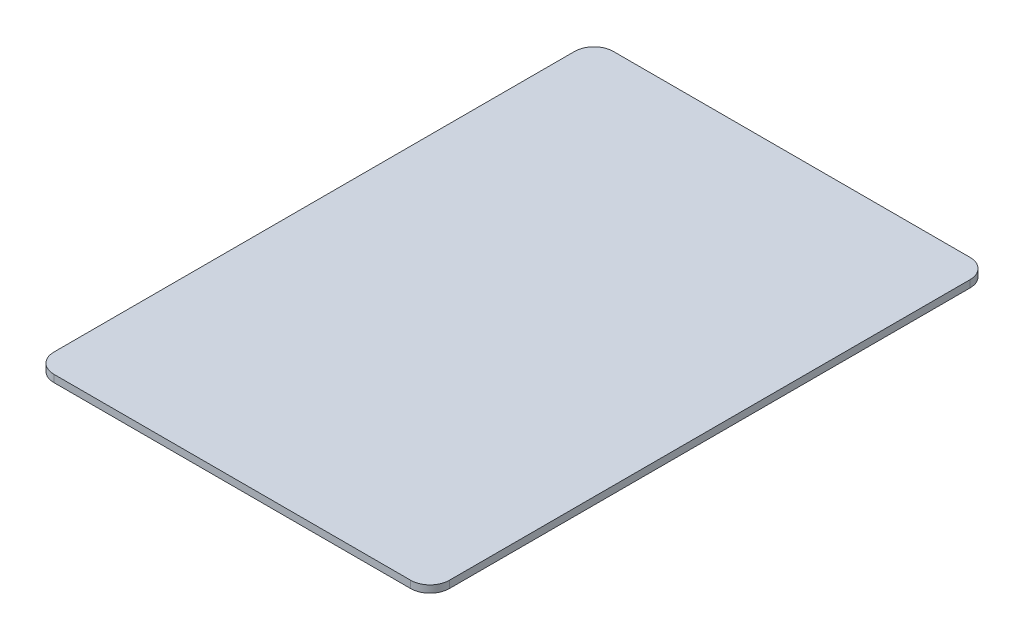
ISO-10303-21;
HEADER;
FILE_DESCRIPTION(('STEP AP214'),'2;1');
FILE_NAME('part.step','',(''),(''),'','','');
FILE_SCHEMA(('AUTOMOTIVE_DESIGN { 1 0 10303 214 1 1 1 1 }'));
ENDSEC;
DATA;
#1=APPLICATION_CONTEXT('core data for automotive mechanical design processes');
#2=APPLICATION_PROTOCOL_DEFINITION('international standard','automotive_design',2000,#1);
#3=PRODUCT_CONTEXT('',#1,'mechanical');
#4=PRODUCT('Part','Part','',(#3));
#5=PRODUCT_RELATED_PRODUCT_CATEGORY('part','',(#4));
#6=PRODUCT_DEFINITION_FORMATION('','',#4);
#7=PRODUCT_DEFINITION_CONTEXT('part definition',#1,'design');
#8=PRODUCT_DEFINITION('design','',#6,#7);
#9=PRODUCT_DEFINITION_SHAPE('','',#8);
#10=(LENGTH_UNIT() NAMED_UNIT(*) SI_UNIT(.MILLI.,.METRE.));
#11=(NAMED_UNIT(*) PLANE_ANGLE_UNIT() SI_UNIT($,.RADIAN.));
#12=(NAMED_UNIT(*) SI_UNIT($,.STERADIAN.) SOLID_ANGLE_UNIT());
#13=UNCERTAINTY_MEASURE_WITH_UNIT(LENGTH_MEASURE(1.E-05),#10,'distance_accuracy_value','');
#14=(GEOMETRIC_REPRESENTATION_CONTEXT(3) GLOBAL_UNCERTAINTY_ASSIGNED_CONTEXT((#13)) GLOBAL_UNIT_ASSIGNED_CONTEXT((#10,
#11,#12)) REPRESENTATION_CONTEXT('',''));
#15=CARTESIAN_POINT('',(0.,0.,0.));
#16=DIRECTION('',(0.,0.,1.));
#17=DIRECTION('',(1.,0.,0.));
#18=AXIS2_PLACEMENT_3D('',#15,#16,#17);
#19=CARTESIAN_POINT('',(-52.07,1.905,73.66));
#20=DIRECTION('',(-1.,0.,0.));
#21=DIRECTION('',(0.,0.,1.));
#22=AXIS2_PLACEMENT_3D('',#19,#20,#21);
#23=PLANE('',#22);
#24=DIRECTION('',(0.,0.,-1.));
#25=VECTOR('',#24,1.);
#26=CARTESIAN_POINT('',(-52.07,1.905,73.66));
#27=LINE('',#26,#25);
#28=CARTESIAN_POINT('',(-52.07,1.905,68.58));
#29=VERTEX_POINT('',#28);
#30=CARTESIAN_POINT('',(-52.07,1.905,-68.58));
#31=VERTEX_POINT('',#30);
#32=EDGE_CURVE('E162',#29,#31,#27,.T.);
#33=ORIENTED_EDGE('',*,*,#32,.T.);
#34=DIRECTION('',(0.,-1.,0.));
#35=VECTOR('',#34,1.);
#36=CARTESIAN_POINT('',(-52.07,1.905,-68.58));
#37=LINE('',#36,#35);
#38=CARTESIAN_POINT('',(-52.07,0.,-68.58));
#39=VERTEX_POINT('',#38);
#40=EDGE_CURVE('E118',#31,#39,#37,.T.);
#41=ORIENTED_EDGE('',*,*,#40,.T.);
#42=DIRECTION('',(0.,0.,-1.));
#43=VECTOR('',#42,1.);
#44=CARTESIAN_POINT('',(-52.07,0.,73.66));
#45=LINE('',#44,#43);
#46=CARTESIAN_POINT('',(-52.07,0.,68.58));
#47=VERTEX_POINT('',#46);
#48=EDGE_CURVE('E103',#47,#39,#45,.T.);
#49=ORIENTED_EDGE('',*,*,#48,.F.);
#50=DIRECTION('',(0.,-1.,0.));
#51=VECTOR('',#50,1.);
#52=CARTESIAN_POINT('',(-52.07,1.905,68.58));
#53=LINE('',#52,#51);
#54=EDGE_CURVE('E115',#47,#29,#53,.F.);
#55=ORIENTED_EDGE('',*,*,#54,.T.);
#56=EDGE_LOOP('',(#33,#41,#49,#55));
#57=FACE_BOUND('',#56,.T.);
#58=ADVANCED_FACE('F33',(#57),#23,.T.);
#59=CARTESIAN_POINT('',(-52.07,1.905,73.66));
#60=DIRECTION('',(0.,0.,-1.));
#61=DIRECTION('',(-1.,0.,0.));
#62=AXIS2_PLACEMENT_3D('',#59,#60,#61);
#63=PLANE('',#62);
#64=DIRECTION('',(1.,0.,0.));
#65=VECTOR('',#64,1.);
#66=CARTESIAN_POINT('',(-52.07,1.905,73.66));
#67=LINE('',#66,#65);
#68=CARTESIAN_POINT('',(-46.99,1.905,73.66));
#69=VERTEX_POINT('',#68);
#70=CARTESIAN_POINT('',(46.99,1.905,73.66));
#71=VERTEX_POINT('',#70);
#72=EDGE_CURVE('E124',#69,#71,#67,.T.);
#73=ORIENTED_EDGE('',*,*,#72,.F.);
#74=DIRECTION('',(0.,-1.,0.));
#75=VECTOR('',#74,1.);
#76=CARTESIAN_POINT('',(-46.99,0.,73.66));
#77=LINE('',#76,#75);
#78=CARTESIAN_POINT('',(-46.99,0.,73.66));
#79=VERTEX_POINT('',#78);
#80=EDGE_CURVE('E11',#69,#79,#77,.T.);
#81=ORIENTED_EDGE('',*,*,#80,.T.);
#82=DIRECTION('',(1.,0.,0.));
#83=VECTOR('',#82,1.);
#84=CARTESIAN_POINT('',(-52.07,0.,73.66));
#85=LINE('',#84,#83);
#86=CARTESIAN_POINT('',(46.99,0.,73.66));
#87=VERTEX_POINT('',#86);
#88=EDGE_CURVE('E105',#79,#87,#85,.T.);
#89=ORIENTED_EDGE('',*,*,#88,.T.);
#90=DIRECTION('',(0.,-1.,0.));
#91=VECTOR('',#90,1.);
#92=CARTESIAN_POINT('',(46.99,1.905,73.66));
#93=LINE('',#92,#91);
#94=EDGE_CURVE('E41',#87,#71,#93,.F.);
#95=ORIENTED_EDGE('',*,*,#94,.T.);
#96=EDGE_LOOP('',(#73,#81,#89,#95));
#97=FACE_BOUND('',#96,.T.);
#98=ADVANCED_FACE('F153',(#97),#63,.F.);
#99=CARTESIAN_POINT('',(52.07,1.905,73.66));
#100=DIRECTION('',(-1.,0.,0.));
#101=DIRECTION('',(0.,0.,1.));
#102=AXIS2_PLACEMENT_3D('',#99,#100,#101);
#103=PLANE('',#102);
#104=DIRECTION('',(0.,0.,-1.));
#105=VECTOR('',#104,1.);
#106=CARTESIAN_POINT('',(52.07,0.,73.66));
#107=LINE('',#106,#105);
#108=CARTESIAN_POINT('',(52.07,0.,68.58));
#109=VERTEX_POINT('',#108);
#110=CARTESIAN_POINT('',(52.07,0.,-68.58));
#111=VERTEX_POINT('',#110);
#112=EDGE_CURVE('E160',#109,#111,#107,.T.);
#113=ORIENTED_EDGE('',*,*,#112,.T.);
#114=DIRECTION('',(0.,-1.,0.));
#115=VECTOR('',#114,1.);
#116=CARTESIAN_POINT('',(52.07,1.905,-68.58));
#117=LINE('',#116,#115);
#118=CARTESIAN_POINT('',(52.07,1.905,-68.58));
#119=VERTEX_POINT('',#118);
#120=EDGE_CURVE('E48',#111,#119,#117,.F.);
#121=ORIENTED_EDGE('',*,*,#120,.T.);
#122=DIRECTION('',(0.,0.,-1.));
#123=VECTOR('',#122,1.);
#124=CARTESIAN_POINT('',(52.07,1.905,73.66));
#125=LINE('',#124,#123);
#126=CARTESIAN_POINT('',(52.07,1.905,68.58));
#127=VERTEX_POINT('',#126);
#128=EDGE_CURVE('E127',#127,#119,#125,.T.);
#129=ORIENTED_EDGE('',*,*,#128,.F.);
#130=DIRECTION('',(0.,-1.,0.));
#131=VECTOR('',#130,1.);
#132=CARTESIAN_POINT('',(52.07,1.905,68.58));
#133=LINE('',#132,#131);
#134=EDGE_CURVE('E147',#127,#109,#133,.T.);
#135=ORIENTED_EDGE('',*,*,#134,.T.);
#136=EDGE_LOOP('',(#113,#121,#129,#135));
#137=FACE_BOUND('',#136,.T.);
#138=ADVANCED_FACE('F159',(#137),#103,.F.);
#139=CARTESIAN_POINT('',(-52.07,1.905,-73.66));
#140=DIRECTION('',(0.,0.,-1.));
#141=DIRECTION('',(-1.,0.,0.));
#142=AXIS2_PLACEMENT_3D('',#139,#140,#141);
#143=PLANE('',#142);
#144=DIRECTION('',(1.,0.,0.));
#145=VECTOR('',#144,1.);
#146=CARTESIAN_POINT('',(-52.07,0.,-73.66));
#147=LINE('',#146,#145);
#148=CARTESIAN_POINT('',(-46.99,0.,-73.66));
#149=VERTEX_POINT('',#148);
#150=CARTESIAN_POINT('',(46.99,0.,-73.66));
#151=VERTEX_POINT('',#150);
#152=EDGE_CURVE('E119',#149,#151,#147,.T.);
#153=ORIENTED_EDGE('',*,*,#152,.F.);
#154=DIRECTION('',(0.,-1.,0.));
#155=VECTOR('',#154,1.);
#156=CARTESIAN_POINT('',(-46.99,1.905,-73.66));
#157=LINE('',#156,#155);
#158=CARTESIAN_POINT('',(-46.99,1.905,-73.66));
#159=VERTEX_POINT('',#158);
#160=EDGE_CURVE('E139',#149,#159,#157,.F.);
#161=ORIENTED_EDGE('',*,*,#160,.T.);
#162=DIRECTION('',(1.,0.,0.));
#163=VECTOR('',#162,1.);
#164=CARTESIAN_POINT('',(-52.07,1.905,-73.66));
#165=LINE('',#164,#163);
#166=CARTESIAN_POINT('',(46.99,1.905,-73.66));
#167=VERTEX_POINT('',#166);
#168=EDGE_CURVE('E166',#159,#167,#165,.T.);
#169=ORIENTED_EDGE('',*,*,#168,.T.);
#170=DIRECTION('',(0.,-1.,0.));
#171=VECTOR('',#170,1.);
#172=CARTESIAN_POINT('',(46.99,0.,-73.66));
#173=LINE('',#172,#171);
#174=EDGE_CURVE('E136',#167,#151,#173,.T.);
#175=ORIENTED_EDGE('',*,*,#174,.T.);
#176=EDGE_LOOP('',(#153,#161,#169,#175));
#177=FACE_BOUND('',#176,.T.);
#178=ADVANCED_FACE('F175',(#177),#143,.T.);
#179=CARTESIAN_POINT('',(0.,1.905,0.));
#180=DIRECTION('',(0.,-1.,0.));
#181=DIRECTION('',(0.,0.,-1.));
#182=AXIS2_PLACEMENT_3D('',#179,#180,#181);
#183=PLANE('',#182);
#184=ORIENTED_EDGE('',*,*,#168,.F.);
#185=CARTESIAN_POINT('',(-46.99,1.905,-68.58));
#186=DIRECTION('',(0.,-1.,0.));
#187=DIRECTION('',(0.,0.,-1.));
#188=AXIS2_PLACEMENT_3D('',#185,#186,#187);
#189=CIRCLE('',#188,5.08);
#190=EDGE_CURVE('E145',#159,#31,#189,.F.);
#191=ORIENTED_EDGE('',*,*,#190,.T.);
#192=ORIENTED_EDGE('',*,*,#32,.F.);
#193=CARTESIAN_POINT('',(-46.99,1.905,68.58));
#194=DIRECTION('',(0.,-1.,0.));
#195=DIRECTION('',(0.,0.,-1.));
#196=AXIS2_PLACEMENT_3D('',#193,#194,#195);
#197=CIRCLE('',#196,5.08);
#198=EDGE_CURVE('E123',#29,#69,#197,.F.);
#199=ORIENTED_EDGE('',*,*,#198,.T.);
#200=ORIENTED_EDGE('',*,*,#72,.T.);
#201=CARTESIAN_POINT('',(46.99,1.905,68.58));
#202=DIRECTION('',(0.,-1.,0.));
#203=DIRECTION('',(0.,0.,-1.));
#204=AXIS2_PLACEMENT_3D('',#201,#202,#203);
#205=CIRCLE('',#204,5.08);
#206=EDGE_CURVE('E55',#71,#127,#205,.F.);
#207=ORIENTED_EDGE('',*,*,#206,.T.);
#208=ORIENTED_EDGE('',*,*,#128,.T.);
#209=CARTESIAN_POINT('',(46.99,1.905,-68.58));
#210=DIRECTION('',(0.,-1.,0.));
#211=DIRECTION('',(0.,0.,-1.));
#212=AXIS2_PLACEMENT_3D('',#209,#210,#211);
#213=CIRCLE('',#212,5.08);
#214=EDGE_CURVE('E143',#119,#167,#213,.F.);
#215=ORIENTED_EDGE('',*,*,#214,.T.);
#216=EDGE_LOOP('',(#184,#191,#192,#199,#200,#207,#208,#215));
#217=FACE_BOUND('',#216,.T.);
#218=ADVANCED_FACE('F156',(#217),#183,.F.);
#219=CARTESIAN_POINT('',(0.,0.,0.));
#220=DIRECTION('',(0.,-1.,0.));
#221=DIRECTION('',(0.,0.,-1.));
#222=AXIS2_PLACEMENT_3D('',#219,#220,#221);
#223=PLANE('',#222);
#224=ORIENTED_EDGE('',*,*,#48,.T.);
#225=CARTESIAN_POINT('',(-46.99,0.,-68.58));
#226=DIRECTION('',(0.,-1.,0.));
#227=DIRECTION('',(0.,0.,-1.));
#228=AXIS2_PLACEMENT_3D('',#225,#226,#227);
#229=CIRCLE('',#228,5.08);
#230=EDGE_CURVE('E134',#39,#149,#229,.T.);
#231=ORIENTED_EDGE('',*,*,#230,.T.);
#232=ORIENTED_EDGE('',*,*,#152,.T.);
#233=CARTESIAN_POINT('',(46.99,0.,-68.58));
#234=DIRECTION('',(0.,-1.,0.));
#235=DIRECTION('',(0.,0.,-1.));
#236=AXIS2_PLACEMENT_3D('',#233,#234,#235);
#237=CIRCLE('',#236,5.08);
#238=EDGE_CURVE('E109',#151,#111,#237,.T.);
#239=ORIENTED_EDGE('',*,*,#238,.T.);
#240=ORIENTED_EDGE('',*,*,#112,.F.);
#241=CARTESIAN_POINT('',(46.99,0.,68.58));
#242=DIRECTION('',(0.,-1.,0.));
#243=DIRECTION('',(0.,0.,-1.));
#244=AXIS2_PLACEMENT_3D('',#241,#242,#243);
#245=CIRCLE('',#244,5.08);
#246=EDGE_CURVE('E110',#109,#87,#245,.T.);
#247=ORIENTED_EDGE('',*,*,#246,.T.);
#248=ORIENTED_EDGE('',*,*,#88,.F.);
#249=CARTESIAN_POINT('',(-46.99,0.,68.58));
#250=DIRECTION('',(0.,-1.,0.));
#251=DIRECTION('',(0.,0.,-1.));
#252=AXIS2_PLACEMENT_3D('',#249,#250,#251);
#253=CIRCLE('',#252,5.08);
#254=EDGE_CURVE('E100',#79,#47,#253,.T.);
#255=ORIENTED_EDGE('',*,*,#254,.T.);
#256=EDGE_LOOP('',(#224,#231,#232,#239,#240,#247,#248,#255));
#257=FACE_BOUND('',#256,.T.);
#258=ADVANCED_FACE('F102',(#257),#223,.T.);
#259=CARTESIAN_POINT('',(-46.99,1.905,-68.58));
#260=DIRECTION('',(0.,-1.,0.));
#261=DIRECTION('',(0.,0.,-1.));
#262=AXIS2_PLACEMENT_3D('',#259,#260,#261);
#263=CYLINDRICAL_SURFACE('',#262,5.08);
#264=ORIENTED_EDGE('',*,*,#190,.F.);
#265=ORIENTED_EDGE('',*,*,#160,.F.);
#266=ORIENTED_EDGE('',*,*,#230,.F.);
#267=ORIENTED_EDGE('',*,*,#40,.F.);
#268=EDGE_LOOP('',(#264,#265,#266,#267));
#269=FACE_BOUND('',#268,.T.);
#270=ADVANCED_FACE('F171',(#269),#263,.T.);
#271=CARTESIAN_POINT('',(46.99,1.905,-68.58));
#272=DIRECTION('',(0.,1.,0.));
#273=DIRECTION('',(0.,0.,1.));
#274=AXIS2_PLACEMENT_3D('',#271,#272,#273);
#275=CYLINDRICAL_SURFACE('',#274,5.08);
#276=ORIENTED_EDGE('',*,*,#214,.F.);
#277=ORIENTED_EDGE('',*,*,#120,.F.);
#278=ORIENTED_EDGE('',*,*,#238,.F.);
#279=ORIENTED_EDGE('',*,*,#174,.F.);
#280=EDGE_LOOP('',(#276,#277,#278,#279));
#281=FACE_BOUND('',#280,.T.);
#282=ADVANCED_FACE('F179',(#281),#275,.T.);
#283=CARTESIAN_POINT('',(-46.99,1.905,68.58));
#284=DIRECTION('',(0.,1.,0.));
#285=DIRECTION('',(0.,0.,1.));
#286=AXIS2_PLACEMENT_3D('',#283,#284,#285);
#287=CYLINDRICAL_SURFACE('',#286,5.08);
#288=ORIENTED_EDGE('',*,*,#198,.F.);
#289=ORIENTED_EDGE('',*,*,#54,.F.);
#290=ORIENTED_EDGE('',*,*,#254,.F.);
#291=ORIENTED_EDGE('',*,*,#80,.F.);
#292=EDGE_LOOP('',(#288,#289,#290,#291));
#293=FACE_BOUND('',#292,.T.);
#294=ADVANCED_FACE('F122',(#293),#287,.T.);
#295=CARTESIAN_POINT('',(46.99,1.905,68.58));
#296=DIRECTION('',(0.,-1.,0.));
#297=DIRECTION('',(0.,0.,-1.));
#298=AXIS2_PLACEMENT_3D('',#295,#296,#297);
#299=CYLINDRICAL_SURFACE('',#298,5.08);
#300=ORIENTED_EDGE('',*,*,#206,.F.);
#301=ORIENTED_EDGE('',*,*,#94,.F.);
#302=ORIENTED_EDGE('',*,*,#246,.F.);
#303=ORIENTED_EDGE('',*,*,#134,.F.);
#304=EDGE_LOOP('',(#300,#301,#302,#303));
#305=FACE_BOUND('',#304,.T.);
#306=ADVANCED_FACE('F35',(#305),#299,.T.);
#307=CLOSED_SHELL('',(#58,#98,#138,#178,#218,#258,#270,#282,#294,#306));
#308=MANIFOLD_SOLID_BREP('B2',#307);
#309=ADVANCED_BREP_SHAPE_REPRESENTATION('',(#18,#308),#14);
#310=SHAPE_DEFINITION_REPRESENTATION(#9,#309);
ENDSEC;
END-ISO-10303-21;
